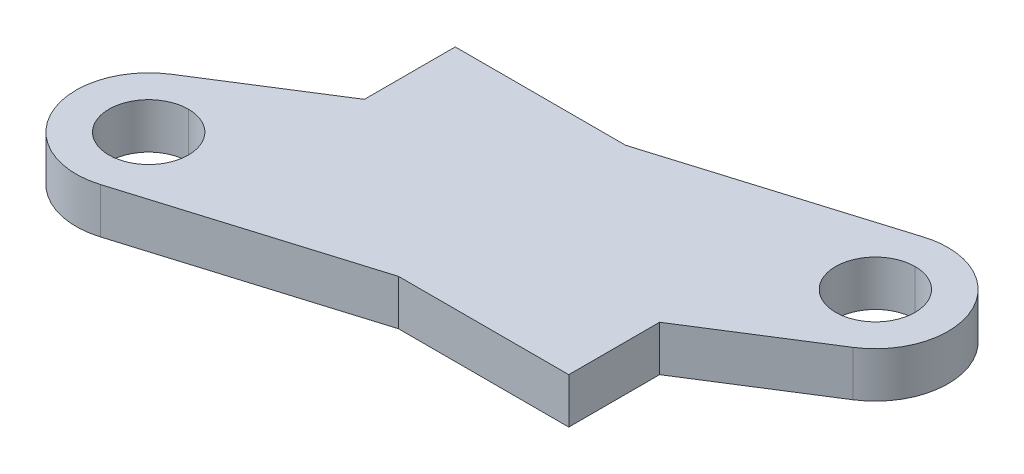
ISO-10303-21;
HEADER;
FILE_DESCRIPTION(('STEP AP214'),'2;1');
FILE_NAME('part.step','',(''),(''),'','','');
FILE_SCHEMA(('AUTOMOTIVE_DESIGN { 1 0 10303 214 1 1 1 1 }'));
ENDSEC;
DATA;
#1=APPLICATION_CONTEXT('core data for automotive mechanical design processes');
#2=APPLICATION_PROTOCOL_DEFINITION('international standard','automotive_design',2000,#1);
#3=PRODUCT_CONTEXT('',#1,'mechanical');
#4=PRODUCT('Part','Part','',(#3));
#5=PRODUCT_RELATED_PRODUCT_CATEGORY('part','',(#4));
#6=PRODUCT_DEFINITION_FORMATION('','',#4);
#7=PRODUCT_DEFINITION_CONTEXT('part definition',#1,'design');
#8=PRODUCT_DEFINITION('design','',#6,#7);
#9=PRODUCT_DEFINITION_SHAPE('','',#8);
#10=(LENGTH_UNIT() NAMED_UNIT(*) SI_UNIT(.MILLI.,.METRE.));
#11=(NAMED_UNIT(*) PLANE_ANGLE_UNIT() SI_UNIT($,.RADIAN.));
#12=(NAMED_UNIT(*) SI_UNIT($,.STERADIAN.) SOLID_ANGLE_UNIT());
#13=UNCERTAINTY_MEASURE_WITH_UNIT(LENGTH_MEASURE(1.E-05),#10,'distance_accuracy_value','');
#14=(GEOMETRIC_REPRESENTATION_CONTEXT(3) GLOBAL_UNCERTAINTY_ASSIGNED_CONTEXT((#13)) GLOBAL_UNIT_ASSIGNED_CONTEXT((#10,
#11,#12)) REPRESENTATION_CONTEXT('',''));
#15=CARTESIAN_POINT('',(0.,0.,0.));
#16=DIRECTION('',(0.,0.,1.));
#17=DIRECTION('',(1.,0.,0.));
#18=AXIS2_PLACEMENT_3D('',#15,#16,#17);
#19=CARTESIAN_POINT('',(11.,2.,-5.));
#20=DIRECTION('',(0.,-1.,0.));
#21=DIRECTION('',(0.,0.,-1.));
#22=AXIS2_PLACEMENT_3D('',#19,#20,#21);
#23=CYLINDRICAL_SURFACE('',#22,1.75);
#24=DIRECTION('',(0.,-1.,0.));
#25=VECTOR('',#24,1.);
#26=CARTESIAN_POINT('',(11.,2.,-3.25));
#27=LINE('',#26,#25);
#28=CARTESIAN_POINT('',(11.,2.,-3.25));
#29=VERTEX_POINT('',#28);
#30=CARTESIAN_POINT('',(11.,0.,-3.25));
#31=VERTEX_POINT('',#30);
#32=EDGE_CURVE('E266',#29,#31,#27,.T.);
#33=ORIENTED_EDGE('',*,*,#32,.F.);
#34=CARTESIAN_POINT('',(11.,2.,-5.));
#35=DIRECTION('',(0.,1.,0.));
#36=DIRECTION('',(0.,0.,1.));
#37=AXIS2_PLACEMENT_3D('',#34,#35,#36);
#38=CIRCLE('',#37,1.75);
#39=CARTESIAN_POINT('',(11.,2.,-6.75));
#40=VERTEX_POINT('',#39);
#41=EDGE_CURVE('E193',#29,#40,#38,.T.);
#42=ORIENTED_EDGE('',*,*,#41,.T.);
#43=DIRECTION('',(0.,-1.,0.));
#44=VECTOR('',#43,1.);
#45=CARTESIAN_POINT('',(11.,2.,-6.75));
#46=LINE('',#45,#44);
#47=CARTESIAN_POINT('',(11.,0.,-6.75));
#48=VERTEX_POINT('',#47);
#49=EDGE_CURVE('E258',#40,#48,#46,.T.);
#50=ORIENTED_EDGE('',*,*,#49,.T.);
#51=CARTESIAN_POINT('',(11.,0.,-5.));
#52=DIRECTION('',(0.,1.,0.));
#53=DIRECTION('',(0.,0.,1.));
#54=AXIS2_PLACEMENT_3D('',#51,#52,#53);
#55=CIRCLE('',#54,1.75);
#56=EDGE_CURVE('E129',#31,#48,#55,.T.);
#57=ORIENTED_EDGE('',*,*,#56,.F.);
#58=EDGE_LOOP('',(#33,#42,#50,#57));
#59=FACE_BOUND('',#58,.T.);
#60=ADVANCED_FACE('F17',(#59),#23,.F.);
#61=CARTESIAN_POINT('',(-11.,2.,5.));
#62=DIRECTION('',(0.,-1.,0.));
#63=DIRECTION('',(0.,0.,-1.));
#64=AXIS2_PLACEMENT_3D('',#61,#62,#63);
#65=CYLINDRICAL_SURFACE('',#64,1.75);
#66=DIRECTION('',(0.,-1.,0.));
#67=VECTOR('',#66,1.);
#68=CARTESIAN_POINT('',(-11.,2.,6.75));
#69=LINE('',#68,#67);
#70=CARTESIAN_POINT('',(-11.,2.,6.75));
#71=VERTEX_POINT('',#70);
#72=CARTESIAN_POINT('',(-11.,0.,6.75));
#73=VERTEX_POINT('',#72);
#74=EDGE_CURVE('E245',#71,#73,#69,.T.);
#75=ORIENTED_EDGE('',*,*,#74,.F.);
#76=CARTESIAN_POINT('',(-11.,2.,5.));
#77=DIRECTION('',(0.,1.,0.));
#78=DIRECTION('',(0.,0.,1.));
#79=AXIS2_PLACEMENT_3D('',#76,#77,#78);
#80=CIRCLE('',#79,1.75);
#81=CARTESIAN_POINT('',(-11.,2.,3.25));
#82=VERTEX_POINT('',#81);
#83=EDGE_CURVE('E196',#71,#82,#80,.T.);
#84=ORIENTED_EDGE('',*,*,#83,.T.);
#85=DIRECTION('',(0.,-1.,0.));
#86=VECTOR('',#85,1.);
#87=CARTESIAN_POINT('',(-11.,2.,3.25));
#88=LINE('',#87,#86);
#89=CARTESIAN_POINT('',(-11.,0.,3.25));
#90=VERTEX_POINT('',#89);
#91=EDGE_CURVE('E237',#82,#90,#88,.T.);
#92=ORIENTED_EDGE('',*,*,#91,.T.);
#93=CARTESIAN_POINT('',(-11.,0.,5.));
#94=DIRECTION('',(0.,1.,0.));
#95=DIRECTION('',(0.,0.,1.));
#96=AXIS2_PLACEMENT_3D('',#93,#94,#95);
#97=CIRCLE('',#96,1.75);
#98=EDGE_CURVE('E133',#73,#90,#97,.T.);
#99=ORIENTED_EDGE('',*,*,#98,.F.);
#100=EDGE_LOOP('',(#75,#84,#92,#99));
#101=FACE_BOUND('',#100,.T.);
#102=ADVANCED_FACE('F370',(#101),#65,.F.);
#103=CARTESIAN_POINT('',(-7.5,2.,-5.));
#104=DIRECTION('',(0.,0.,1.));
#105=DIRECTION('',(1.,0.,0.));
#106=AXIS2_PLACEMENT_3D('',#103,#104,#105);
#107=PLANE('',#106);
#108=DIRECTION('',(-1.,0.,0.));
#109=VECTOR('',#108,1.);
#110=CARTESIAN_POINT('',(-7.5,0.,-5.));
#111=LINE('',#110,#109);
#112=CARTESIAN_POINT('',(0.,0.,-5.));
#113=VERTEX_POINT('',#112);
#114=CARTESIAN_POINT('',(-7.5,0.,-5.));
#115=VERTEX_POINT('',#114);
#116=EDGE_CURVE('E183',#113,#115,#111,.T.);
#117=ORIENTED_EDGE('',*,*,#116,.T.);
#118=DIRECTION('',(0.,-1.,0.));
#119=VECTOR('',#118,1.);
#120=CARTESIAN_POINT('',(-7.5,2.,-5.));
#121=LINE('',#120,#119);
#122=CARTESIAN_POINT('',(-7.5,2.,-5.));
#123=VERTEX_POINT('',#122);
#124=EDGE_CURVE('E128',#123,#115,#121,.T.);
#125=ORIENTED_EDGE('',*,*,#124,.F.);
#126=DIRECTION('',(-1.,0.,0.));
#127=VECTOR('',#126,1.);
#128=CARTESIAN_POINT('',(-7.5,2.,-5.));
#129=LINE('',#128,#127);
#130=CARTESIAN_POINT('',(0.,2.,-5.));
#131=VERTEX_POINT('',#130);
#132=EDGE_CURVE('E200',#131,#123,#129,.T.);
#133=ORIENTED_EDGE('',*,*,#132,.F.);
#134=DIRECTION('',(0.,-1.,0.));
#135=VECTOR('',#134,1.);
#136=CARTESIAN_POINT('',(0.,2.,-5.));
#137=LINE('',#136,#135);
#138=EDGE_CURVE('E11',#131,#113,#137,.T.);
#139=ORIENTED_EDGE('',*,*,#138,.T.);
#140=EDGE_LOOP('',(#117,#125,#133,#139));
#141=FACE_BOUND('',#140,.T.);
#142=ADVANCED_FACE('F372',(#141),#107,.F.);
#143=CARTESIAN_POINT('',(10.0690909090909,2.,-8.06160223812023));
#144=DIRECTION('',(0.290909090909091,0.,0.956750699412572));
#145=DIRECTION('',(0.,-1.,0.));
#146=AXIS2_PLACEMENT_3D('',#143,#144,#145);
#147=PLANE('',#146);
#148=DIRECTION('',(-0.956750699412572,0.,0.290909090909091));
#149=VECTOR('',#148,1.);
#150=CARTESIAN_POINT('',(10.0690909090909,0.,-8.06160223812023));
#151=LINE('',#150,#149);
#152=CARTESIAN_POINT('',(10.0690909090909,0.,-8.06160223812023));
#153=VERTEX_POINT('',#152);
#154=EDGE_CURVE('E178',#153,#113,#151,.T.);
#155=ORIENTED_EDGE('',*,*,#154,.T.);
#156=ORIENTED_EDGE('',*,*,#138,.F.);
#157=DIRECTION('',(-0.956750699412572,0.,0.290909090909091));
#158=VECTOR('',#157,1.);
#159=CARTESIAN_POINT('',(10.0690909090909,2.,-8.06160223812023));
#160=LINE('',#159,#158);
#161=CARTESIAN_POINT('',(10.0690909090909,2.,-8.06160223812023));
#162=VERTEX_POINT('',#161);
#163=EDGE_CURVE('E201',#162,#131,#160,.T.);
#164=ORIENTED_EDGE('',*,*,#163,.F.);
#165=DIRECTION('',(0.,-1.,0.));
#166=VECTOR('',#165,1.);
#167=CARTESIAN_POINT('',(10.0690909090909,2.,-8.06160223812023));
#168=LINE('',#167,#166);
#169=EDGE_CURVE('E223',#162,#153,#168,.T.);
#170=ORIENTED_EDGE('',*,*,#169,.T.);
#171=EDGE_LOOP('',(#155,#156,#164,#170));
#172=FACE_BOUND('',#171,.T.);
#173=ADVANCED_FACE('F380',(#172),#147,.F.);
#174=CARTESIAN_POINT('',(11.,2.,-5.));
#175=DIRECTION('',(0.,-1.,0.));
#176=DIRECTION('',(0.,0.,-1.));
#177=AXIS2_PLACEMENT_3D('',#174,#175,#176);
#178=CYLINDRICAL_SURFACE('',#177,3.2);
#179=DIRECTION('',(0.,-1.,0.));
#180=VECTOR('',#179,1.);
#181=CARTESIAN_POINT('',(11.,2.,-8.2));
#182=LINE('',#181,#180);
#183=CARTESIAN_POINT('',(11.,2.,-8.2));
#184=VERTEX_POINT('',#183);
#185=CARTESIAN_POINT('',(11.,0.,-8.2));
#186=VERTEX_POINT('',#185);
#187=EDGE_CURVE('E229',#184,#186,#182,.T.);
#188=ORIENTED_EDGE('',*,*,#187,.F.);
#189=CARTESIAN_POINT('',(11.,2.,-5.));
#190=DIRECTION('',(0.,1.,0.));
#191=DIRECTION('',(0.,0.,1.));
#192=AXIS2_PLACEMENT_3D('',#189,#190,#191);
#193=CIRCLE('',#192,3.2);
#194=CARTESIAN_POINT('',(12.7105144267153,2.,-2.29553325108277));
#195=VERTEX_POINT('',#194);
#196=EDGE_CURVE('E169',#195,#184,#193,.T.);
#197=ORIENTED_EDGE('',*,*,#196,.F.);
#198=DIRECTION('',(0.,-1.,0.));
#199=VECTOR('',#198,1.);
#200=CARTESIAN_POINT('',(12.7105144267153,2.,-2.29553325108277));
#201=LINE('',#200,#199);
#202=CARTESIAN_POINT('',(12.7105144267153,0.,-2.29553325108277));
#203=VERTEX_POINT('',#202);
#204=EDGE_CURVE('E20',#195,#203,#201,.T.);
#205=ORIENTED_EDGE('',*,*,#204,.T.);
#206=CARTESIAN_POINT('',(11.,0.,-5.));
#207=DIRECTION('',(0.,1.,0.));
#208=DIRECTION('',(0.,0.,1.));
#209=AXIS2_PLACEMENT_3D('',#206,#207,#208);
#210=CIRCLE('',#209,3.2);
#211=EDGE_CURVE('E166',#203,#186,#210,.T.);
#212=ORIENTED_EDGE('',*,*,#211,.T.);
#213=EDGE_LOOP('',(#188,#197,#205,#212));
#214=FACE_BOUND('',#213,.T.);
#215=ADVANCED_FACE('F163',(#214),#178,.T.);
#216=CARTESIAN_POINT('',(12.7105144267153,2.,-2.29553325108276));
#217=DIRECTION('',(-0.534535758348519,0.,-0.845145859036636));
#218=DIRECTION('',(-0.845145859036636,0.,0.534535758348519));
#219=AXIS2_PLACEMENT_3D('',#216,#217,#218);
#220=PLANE('',#219);
#221=DIRECTION('',(0.845145859036636,0.,-0.534535758348519));
#222=VECTOR('',#221,1.);
#223=CARTESIAN_POINT('',(12.7105144267153,0.,-2.29553325108276));
#224=LINE('',#223,#222);
#225=CARTESIAN_POINT('',(7.5,0.,1.));
#226=VERTEX_POINT('',#225);
#227=EDGE_CURVE('E121',#226,#203,#224,.T.);
#228=ORIENTED_EDGE('',*,*,#227,.T.);
#229=ORIENTED_EDGE('',*,*,#204,.F.);
#230=DIRECTION('',(0.845145859036636,0.,-0.534535758348519));
#231=VECTOR('',#230,1.);
#232=CARTESIAN_POINT('',(12.7105144267153,2.,-2.29553325108276));
#233=LINE('',#232,#231);
#234=CARTESIAN_POINT('',(7.5,2.,1.));
#235=VERTEX_POINT('',#234);
#236=EDGE_CURVE('E212',#235,#195,#233,.T.);
#237=ORIENTED_EDGE('',*,*,#236,.F.);
#238=DIRECTION('',(0.,-1.,0.));
#239=VECTOR('',#238,1.);
#240=CARTESIAN_POINT('',(7.5,2.,1.));
#241=LINE('',#240,#239);
#242=EDGE_CURVE('E147',#235,#226,#241,.T.);
#243=ORIENTED_EDGE('',*,*,#242,.T.);
#244=EDGE_LOOP('',(#228,#229,#237,#243));
#245=FACE_BOUND('',#244,.T.);
#246=ADVANCED_FACE('F171',(#245),#220,.F.);
#247=CARTESIAN_POINT('',(7.5,2.,1.));
#248=DIRECTION('',(-1.,0.,0.));
#249=DIRECTION('',(0.,0.,1.));
#250=AXIS2_PLACEMENT_3D('',#247,#248,#249);
#251=PLANE('',#250);
#252=DIRECTION('',(0.,0.,-1.));
#253=VECTOR('',#252,1.);
#254=CARTESIAN_POINT('',(7.5,0.,1.));
#255=LINE('',#254,#253);
#256=CARTESIAN_POINT('',(7.5,0.,5.));
#257=VERTEX_POINT('',#256);
#258=EDGE_CURVE('E113',#257,#226,#255,.T.);
#259=ORIENTED_EDGE('',*,*,#258,.T.);
#260=ORIENTED_EDGE('',*,*,#242,.F.);
#261=DIRECTION('',(0.,0.,-1.));
#262=VECTOR('',#261,1.);
#263=CARTESIAN_POINT('',(7.5,2.,1.));
#264=LINE('',#263,#262);
#265=CARTESIAN_POINT('',(7.5,2.,5.));
#266=VERTEX_POINT('',#265);
#267=EDGE_CURVE('E213',#266,#235,#264,.T.);
#268=ORIENTED_EDGE('',*,*,#267,.F.);
#269=DIRECTION('',(0.,-1.,0.));
#270=VECTOR('',#269,1.);
#271=CARTESIAN_POINT('',(7.5,2.,5.));
#272=LINE('',#271,#270);
#273=EDGE_CURVE('E97',#266,#257,#272,.T.);
#274=ORIENTED_EDGE('',*,*,#273,.T.);
#275=EDGE_LOOP('',(#259,#260,#268,#274));
#276=FACE_BOUND('',#275,.T.);
#277=ADVANCED_FACE('F389',(#276),#251,.F.);
#278=CARTESIAN_POINT('',(0.,2.,5.));
#279=DIRECTION('',(0.,0.,-1.));
#280=DIRECTION('',(-1.,0.,0.));
#281=AXIS2_PLACEMENT_3D('',#278,#279,#280);
#282=PLANE('',#281);
#283=DIRECTION('',(1.,0.,0.));
#284=VECTOR('',#283,1.);
#285=CARTESIAN_POINT('',(0.,0.,5.));
#286=LINE('',#285,#284);
#287=CARTESIAN_POINT('',(0.,0.,5.));
#288=VERTEX_POINT('',#287);
#289=EDGE_CURVE('E89',#288,#257,#286,.T.);
#290=ORIENTED_EDGE('',*,*,#289,.T.);
#291=ORIENTED_EDGE('',*,*,#273,.F.);
#292=DIRECTION('',(1.,0.,0.));
#293=VECTOR('',#292,1.);
#294=CARTESIAN_POINT('',(0.,2.,5.));
#295=LINE('',#294,#293);
#296=CARTESIAN_POINT('',(0.,2.,5.));
#297=VERTEX_POINT('',#296);
#298=EDGE_CURVE('E92',#297,#266,#295,.T.);
#299=ORIENTED_EDGE('',*,*,#298,.F.);
#300=DIRECTION('',(0.,-1.,0.));
#301=VECTOR('',#300,1.);
#302=CARTESIAN_POINT('',(0.,2.,5.));
#303=LINE('',#302,#301);
#304=EDGE_CURVE('E85',#297,#288,#303,.T.);
#305=ORIENTED_EDGE('',*,*,#304,.T.);
#306=EDGE_LOOP('',(#290,#291,#299,#305));
#307=FACE_BOUND('',#306,.T.);
#308=ADVANCED_FACE('F87',(#307),#282,.F.);
#309=CARTESIAN_POINT('',(-10.0690909090909,2.,8.06160223812024));
#310=DIRECTION('',(-0.290909090909092,0.,-0.956750699412572));
#311=DIRECTION('',(-0.956750699412572,0.,0.290909090909092));
#312=AXIS2_PLACEMENT_3D('',#309,#310,#311);
#313=PLANE('',#312);
#314=DIRECTION('',(0.956750699412572,0.,-0.290909090909092));
#315=VECTOR('',#314,1.);
#316=CARTESIAN_POINT('',(-10.0690909090909,0.,8.06160223812024));
#317=LINE('',#316,#315);
#318=CARTESIAN_POINT('',(-10.0690909090909,0.,8.06160223812024));
#319=VERTEX_POINT('',#318);
#320=EDGE_CURVE('E101',#319,#288,#317,.T.);
#321=ORIENTED_EDGE('',*,*,#320,.T.);
#322=ORIENTED_EDGE('',*,*,#304,.F.);
#323=DIRECTION('',(0.956750699412572,0.,-0.290909090909092));
#324=VECTOR('',#323,1.);
#325=CARTESIAN_POINT('',(-10.0690909090909,2.,8.06160223812024));
#326=LINE('',#325,#324);
#327=CARTESIAN_POINT('',(-10.0690909090909,2.,8.06160223812024));
#328=VERTEX_POINT('',#327);
#329=EDGE_CURVE('E218',#328,#297,#326,.T.);
#330=ORIENTED_EDGE('',*,*,#329,.F.);
#331=DIRECTION('',(0.,-1.,0.));
#332=VECTOR('',#331,1.);
#333=CARTESIAN_POINT('',(-10.0690909090909,2.,8.06160223812024));
#334=LINE('',#333,#332);
#335=EDGE_CURVE('E98',#328,#319,#334,.T.);
#336=ORIENTED_EDGE('',*,*,#335,.T.);
#337=EDGE_LOOP('',(#321,#322,#330,#336));
#338=FACE_BOUND('',#337,.T.);
#339=ADVANCED_FACE('F102',(#338),#313,.F.);
#340=CARTESIAN_POINT('',(-11.,2.,5.));
#341=DIRECTION('',(0.,-1.,0.));
#342=DIRECTION('',(0.,0.,-1.));
#343=AXIS2_PLACEMENT_3D('',#340,#341,#342);
#344=CYLINDRICAL_SURFACE('',#343,3.2);
#345=CARTESIAN_POINT('',(-11.,0.,5.));
#346=DIRECTION('',(0.,1.,0.));
#347=DIRECTION('',(0.,0.,1.));
#348=AXIS2_PLACEMENT_3D('',#345,#346,#347);
#349=CIRCLE('',#348,3.2);
#350=CARTESIAN_POINT('',(-12.7105144267153,0.,2.29553325108277));
#351=VERTEX_POINT('',#350);
#352=EDGE_CURVE('E107',#351,#319,#349,.T.);
#353=ORIENTED_EDGE('',*,*,#352,.T.);
#354=ORIENTED_EDGE('',*,*,#335,.F.);
#355=CARTESIAN_POINT('',(-11.,2.,5.));
#356=DIRECTION('',(0.,1.,0.));
#357=DIRECTION('',(0.,0.,1.));
#358=AXIS2_PLACEMENT_3D('',#355,#356,#357);
#359=CIRCLE('',#358,3.2);
#360=CARTESIAN_POINT('',(-12.7105144267153,2.,2.29553325108277));
#361=VERTEX_POINT('',#360);
#362=EDGE_CURVE('E230',#361,#328,#359,.T.);
#363=ORIENTED_EDGE('',*,*,#362,.F.);
#364=DIRECTION('',(0.,-1.,0.));
#365=VECTOR('',#364,1.);
#366=CARTESIAN_POINT('',(-12.7105144267153,2.,2.29553325108277));
#367=LINE('',#366,#365);
#368=EDGE_CURVE('E39',#361,#351,#367,.T.);
#369=ORIENTED_EDGE('',*,*,#368,.T.);
#370=EDGE_LOOP('',(#353,#354,#363,#369));
#371=FACE_BOUND('',#370,.T.);
#372=ADVANCED_FACE('F396',(#371),#344,.T.);
#373=CARTESIAN_POINT('',(-12.7105144267153,2.,2.29553325108277));
#374=DIRECTION('',(0.534535758348519,0.,0.845145859036636));
#375=DIRECTION('',(0.,-1.,0.));
#376=AXIS2_PLACEMENT_3D('',#373,#374,#375);
#377=PLANE('',#376);
#378=DIRECTION('',(-0.845145859036636,0.,0.534535758348519));
#379=VECTOR('',#378,1.);
#380=CARTESIAN_POINT('',(-12.7105144267153,0.,2.29553325108277));
#381=LINE('',#380,#379);
#382=CARTESIAN_POINT('',(-7.5,0.,-1.));
#383=VERTEX_POINT('',#382);
#384=EDGE_CURVE('E132',#383,#351,#381,.T.);
#385=ORIENTED_EDGE('',*,*,#384,.T.);
#386=ORIENTED_EDGE('',*,*,#368,.F.);
#387=DIRECTION('',(-0.845145859036636,0.,0.534535758348519));
#388=VECTOR('',#387,1.);
#389=CARTESIAN_POINT('',(-12.7105144267153,2.,2.29553325108277));
#390=LINE('',#389,#388);
#391=CARTESIAN_POINT('',(-7.5,2.,-1.));
#392=VERTEX_POINT('',#391);
#393=EDGE_CURVE('E222',#392,#361,#390,.T.);
#394=ORIENTED_EDGE('',*,*,#393,.F.);
#395=DIRECTION('',(0.,-1.,0.));
#396=VECTOR('',#395,1.);
#397=CARTESIAN_POINT('',(-7.5,2.,-1.));
#398=LINE('',#397,#396);
#399=EDGE_CURVE('E125',#392,#383,#398,.T.);
#400=ORIENTED_EDGE('',*,*,#399,.T.);
#401=EDGE_LOOP('',(#385,#386,#394,#400));
#402=FACE_BOUND('',#401,.T.);
#403=ADVANCED_FACE('F399',(#402),#377,.F.);
#404=CARTESIAN_POINT('',(-7.5,2.,-5.));
#405=DIRECTION('',(1.,0.,0.));
#406=DIRECTION('',(0.,0.,-1.));
#407=AXIS2_PLACEMENT_3D('',#404,#405,#406);
#408=PLANE('',#407);
#409=DIRECTION('',(0.,0.,1.));
#410=VECTOR('',#409,1.);
#411=CARTESIAN_POINT('',(-7.5,0.,-5.));
#412=LINE('',#411,#410);
#413=EDGE_CURVE('E189',#115,#383,#412,.T.);
#414=ORIENTED_EDGE('',*,*,#413,.T.);
#415=ORIENTED_EDGE('',*,*,#399,.F.);
#416=DIRECTION('',(0.,0.,1.));
#417=VECTOR('',#416,1.);
#418=CARTESIAN_POINT('',(-7.5,2.,-5.));
#419=LINE('',#418,#417);
#420=EDGE_CURVE('E219',#123,#392,#419,.T.);
#421=ORIENTED_EDGE('',*,*,#420,.F.);
#422=ORIENTED_EDGE('',*,*,#124,.T.);
#423=EDGE_LOOP('',(#414,#415,#421,#422));
#424=FACE_BOUND('',#423,.T.);
#425=ADVANCED_FACE('F392',(#424),#408,.F.);
#426=CARTESIAN_POINT('',(-11.,0.,5.));
#427=DIRECTION('',(0.,1.,0.));
#428=DIRECTION('',(1.,0.,0.));
#429=AXIS2_PLACEMENT_3D('',#426,#427,#428);
#430=PLANE('',#429);
#431=CARTESIAN_POINT('',(11.,0.,-5.));
#432=DIRECTION('',(0.,1.,0.));
#433=DIRECTION('',(0.,0.,1.));
#434=AXIS2_PLACEMENT_3D('',#431,#432,#433);
#435=CIRCLE('',#434,1.75);
#436=EDGE_CURVE('E262',#48,#31,#435,.T.);
#437=ORIENTED_EDGE('',*,*,#436,.T.);
#438=ORIENTED_EDGE('',*,*,#56,.T.);
#439=EDGE_LOOP('',(#437,#438));
#440=FACE_BOUND('',#439,.T.);
#441=CARTESIAN_POINT('',(-11.,0.,5.));
#442=DIRECTION('',(0.,1.,0.));
#443=DIRECTION('',(0.,0.,1.));
#444=AXIS2_PLACEMENT_3D('',#441,#442,#443);
#445=CIRCLE('',#444,1.75);
#446=EDGE_CURVE('E241',#90,#73,#445,.T.);
#447=ORIENTED_EDGE('',*,*,#446,.T.);
#448=ORIENTED_EDGE('',*,*,#98,.T.);
#449=EDGE_LOOP('',(#447,#448));
#450=FACE_BOUND('',#449,.T.);
#451=ORIENTED_EDGE('',*,*,#413,.F.);
#452=ORIENTED_EDGE('',*,*,#116,.F.);
#453=ORIENTED_EDGE('',*,*,#154,.F.);
#454=CARTESIAN_POINT('',(11.,0.,-5.));
#455=DIRECTION('',(0.,1.,0.));
#456=DIRECTION('',(0.,0.,1.));
#457=AXIS2_PLACEMENT_3D('',#454,#455,#456);
#458=CIRCLE('',#457,3.2);
#459=EDGE_CURVE('E175',#186,#153,#458,.T.);
#460=ORIENTED_EDGE('',*,*,#459,.F.);
#461=ORIENTED_EDGE('',*,*,#211,.F.);
#462=ORIENTED_EDGE('',*,*,#227,.F.);
#463=ORIENTED_EDGE('',*,*,#258,.F.);
#464=ORIENTED_EDGE('',*,*,#289,.F.);
#465=ORIENTED_EDGE('',*,*,#320,.F.);
#466=ORIENTED_EDGE('',*,*,#352,.F.);
#467=ORIENTED_EDGE('',*,*,#384,.F.);
#468=EDGE_LOOP('',(#451,#452,#453,#460,#461,#462,#463,#464,#465,#466,#467));
#469=FACE_BOUND('',#468,.T.);
#470=ADVANCED_FACE('F110',(#440,#450,#469),#430,.F.);
#471=CARTESIAN_POINT('',(-11.,2.,5.));
#472=DIRECTION('',(0.,1.,0.));
#473=DIRECTION('',(1.,0.,0.));
#474=AXIS2_PLACEMENT_3D('',#471,#472,#473);
#475=PLANE('',#474);
#476=CARTESIAN_POINT('',(11.,2.,-5.));
#477=DIRECTION('',(0.,1.,0.));
#478=DIRECTION('',(0.,0.,1.));
#479=AXIS2_PLACEMENT_3D('',#476,#477,#478);
#480=CIRCLE('',#479,1.75);
#481=EDGE_CURVE('E270',#40,#29,#480,.T.);
#482=ORIENTED_EDGE('',*,*,#481,.F.);
#483=ORIENTED_EDGE('',*,*,#41,.F.);
#484=EDGE_LOOP('',(#482,#483));
#485=FACE_BOUND('',#484,.T.);
#486=CARTESIAN_POINT('',(-11.,2.,5.));
#487=DIRECTION('',(0.,1.,0.));
#488=DIRECTION('',(0.,0.,1.));
#489=AXIS2_PLACEMENT_3D('',#486,#487,#488);
#490=CIRCLE('',#489,1.75);
#491=EDGE_CURVE('E251',#82,#71,#490,.T.);
#492=ORIENTED_EDGE('',*,*,#491,.F.);
#493=ORIENTED_EDGE('',*,*,#83,.F.);
#494=EDGE_LOOP('',(#492,#493));
#495=FACE_BOUND('',#494,.T.);
#496=ORIENTED_EDGE('',*,*,#420,.T.);
#497=ORIENTED_EDGE('',*,*,#393,.T.);
#498=ORIENTED_EDGE('',*,*,#362,.T.);
#499=ORIENTED_EDGE('',*,*,#329,.T.);
#500=ORIENTED_EDGE('',*,*,#298,.T.);
#501=ORIENTED_EDGE('',*,*,#267,.T.);
#502=ORIENTED_EDGE('',*,*,#236,.T.);
#503=ORIENTED_EDGE('',*,*,#196,.T.);
#504=CARTESIAN_POINT('',(11.,2.,-5.));
#505=DIRECTION('',(0.,1.,0.));
#506=DIRECTION('',(0.,0.,1.));
#507=AXIS2_PLACEMENT_3D('',#504,#505,#506);
#508=CIRCLE('',#507,3.2);
#509=EDGE_CURVE('E236',#184,#162,#508,.T.);
#510=ORIENTED_EDGE('',*,*,#509,.T.);
#511=ORIENTED_EDGE('',*,*,#163,.T.);
#512=ORIENTED_EDGE('',*,*,#132,.T.);
#513=EDGE_LOOP('',(#496,#497,#498,#499,#500,#501,#502,#503,#510,#511,#512));
#514=FACE_BOUND('',#513,.T.);
#515=ADVANCED_FACE('F281',(#485,#495,#514),#475,.T.);
#516=CARTESIAN_POINT('',(11.,2.,-5.));
#517=DIRECTION('',(0.,-1.,0.));
#518=DIRECTION('',(0.,0.,-1.));
#519=AXIS2_PLACEMENT_3D('',#516,#517,#518);
#520=CYLINDRICAL_SURFACE('',#519,3.2);
#521=ORIENTED_EDGE('',*,*,#509,.F.);
#522=ORIENTED_EDGE('',*,*,#187,.T.);
#523=ORIENTED_EDGE('',*,*,#459,.T.);
#524=ORIENTED_EDGE('',*,*,#169,.F.);
#525=EDGE_LOOP('',(#521,#522,#523,#524));
#526=FACE_BOUND('',#525,.T.);
#527=ADVANCED_FACE('F289',(#526),#520,.T.);
#528=CARTESIAN_POINT('',(-11.,2.,5.));
#529=DIRECTION('',(0.,-1.,0.));
#530=DIRECTION('',(0.,0.,-1.));
#531=AXIS2_PLACEMENT_3D('',#528,#529,#530);
#532=CYLINDRICAL_SURFACE('',#531,1.75);
#533=ORIENTED_EDGE('',*,*,#491,.T.);
#534=ORIENTED_EDGE('',*,*,#74,.T.);
#535=ORIENTED_EDGE('',*,*,#446,.F.);
#536=ORIENTED_EDGE('',*,*,#91,.F.);
#537=EDGE_LOOP('',(#533,#534,#535,#536));
#538=FACE_BOUND('',#537,.T.);
#539=ADVANCED_FACE('F368',(#538),#532,.F.);
#540=CARTESIAN_POINT('',(11.,2.,-5.));
#541=DIRECTION('',(0.,-1.,0.));
#542=DIRECTION('',(0.,0.,-1.));
#543=AXIS2_PLACEMENT_3D('',#540,#541,#542);
#544=CYLINDRICAL_SURFACE('',#543,1.75);
#545=ORIENTED_EDGE('',*,*,#481,.T.);
#546=ORIENTED_EDGE('',*,*,#32,.T.);
#547=ORIENTED_EDGE('',*,*,#436,.F.);
#548=ORIENTED_EDGE('',*,*,#49,.F.);
#549=EDGE_LOOP('',(#545,#546,#547,#548));
#550=FACE_BOUND('',#549,.T.);
#551=ADVANCED_FACE('F363',(#550),#544,.F.);
#552=CLOSED_SHELL('',(#60,#102,#142,#173,#215,#246,#277,#308,#339,#372,#403,#425,#470,#515,#527,
#539,#551));
#553=MANIFOLD_SOLID_BREP('B1',#552);
#554=ADVANCED_BREP_SHAPE_REPRESENTATION('',(#18,#553),#14);
#555=SHAPE_DEFINITION_REPRESENTATION(#9,#554);
ENDSEC;
END-ISO-10303-21;
